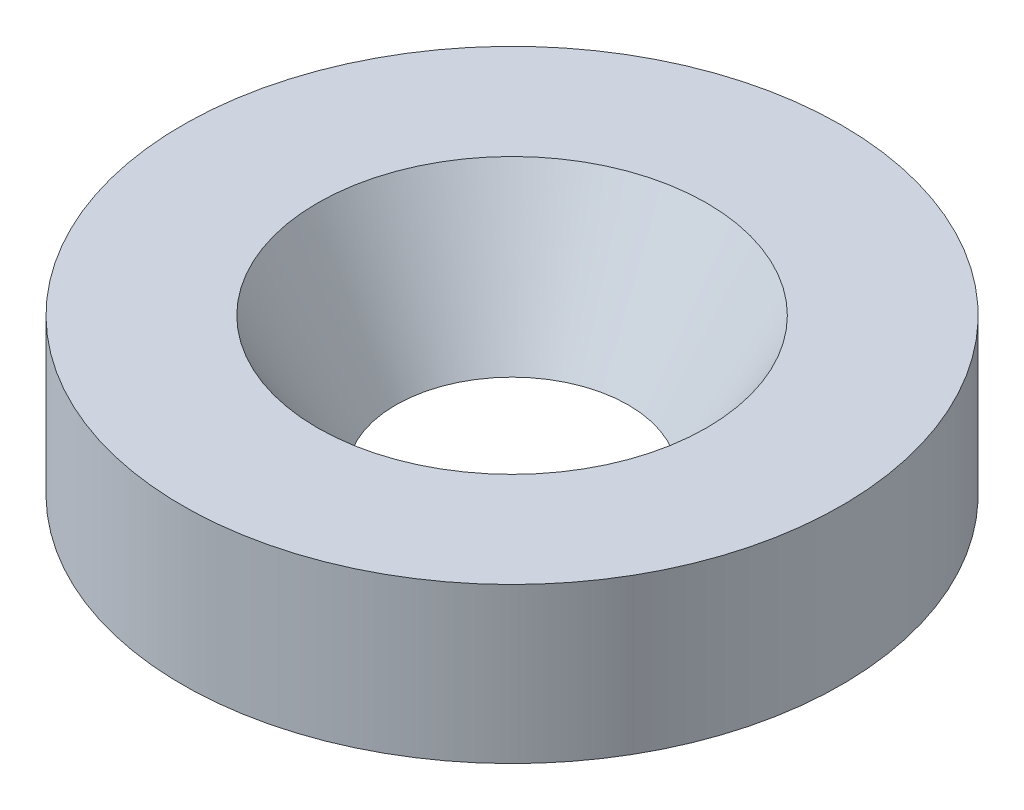
ISO-10303-21;
HEADER;
FILE_DESCRIPTION(('STEP AP214'),'2;1');
FILE_NAME('part.step','',(''),(''),'','','');
FILE_SCHEMA(('AUTOMOTIVE_DESIGN { 1 0 10303 214 1 1 1 1 }'));
ENDSEC;
DATA;
#1=APPLICATION_CONTEXT('core data for automotive mechanical design processes');
#2=APPLICATION_PROTOCOL_DEFINITION('international standard','automotive_design',2000,#1);
#3=PRODUCT_CONTEXT('',#1,'mechanical');
#4=PRODUCT('Part','Part','',(#3));
#5=PRODUCT_RELATED_PRODUCT_CATEGORY('part','',(#4));
#6=PRODUCT_DEFINITION_FORMATION('','',#4);
#7=PRODUCT_DEFINITION_CONTEXT('part definition',#1,'design');
#8=PRODUCT_DEFINITION('design','',#6,#7);
#9=PRODUCT_DEFINITION_SHAPE('','',#8);
#10=(LENGTH_UNIT() NAMED_UNIT(*) SI_UNIT(.MILLI.,.METRE.));
#11=(NAMED_UNIT(*) PLANE_ANGLE_UNIT() SI_UNIT($,.RADIAN.));
#12=(NAMED_UNIT(*) SI_UNIT($,.STERADIAN.) SOLID_ANGLE_UNIT());
#13=UNCERTAINTY_MEASURE_WITH_UNIT(LENGTH_MEASURE(1.E-05),#10,'distance_accuracy_value','');
#14=(GEOMETRIC_REPRESENTATION_CONTEXT(3) GLOBAL_UNCERTAINTY_ASSIGNED_CONTEXT((#13)) GLOBAL_UNIT_ASSIGNED_CONTEXT((#10,
#11,#12)) REPRESENTATION_CONTEXT('',''));
#15=CARTESIAN_POINT('',(0.,0.,0.));
#16=DIRECTION('',(0.,0.,1.));
#17=DIRECTION('',(1.,0.,0.));
#18=AXIS2_PLACEMENT_3D('',#15,#16,#17);
#19=CARTESIAN_POINT('',(8.,0.,0.));
#20=DIRECTION('',(0.,-1.,0.));
#21=DIRECTION('',(0.,0.,-1.));
#22=AXIS2_PLACEMENT_3D('',#19,#20,#21);
#23=PLANE('',#22);
#24=CARTESIAN_POINT('',(0.,0.,0.));
#25=DIRECTION('',(0.,-1.,0.));
#26=DIRECTION('',(0.,0.,-1.));
#27=AXIS2_PLACEMENT_3D('',#24,#25,#26);
#28=CIRCLE('',#27,8.5);
#29=CARTESIAN_POINT('',(0.,0.,-8.5));
#30=VERTEX_POINT('',#29);
#31=EDGE_CURVE('E10',#30,#30,#28,.T.);
#32=ORIENTED_EDGE('',*,*,#31,.T.);
#33=EDGE_LOOP('',(#32));
#34=FACE_BOUND('',#33,.T.);
#35=CARTESIAN_POINT('',(0.,0.,0.));
#36=DIRECTION('',(0.,-1.,0.));
#37=DIRECTION('',(0.,0.,-1.));
#38=AXIS2_PLACEMENT_3D('',#35,#36,#37);
#39=CIRCLE('',#38,8.);
#40=CARTESIAN_POINT('',(0.,0.,-8.));
#41=VERTEX_POINT('',#40);
#42=EDGE_CURVE('E65',#41,#41,#39,.T.);
#43=ORIENTED_EDGE('',*,*,#42,.F.);
#44=EDGE_LOOP('',(#43));
#45=FACE_BOUND('',#44,.T.);
#46=ADVANCED_FACE('F37',(#34,#45),#23,.T.);
#47=CARTESIAN_POINT('',(0.,0.,0.));
#48=DIRECTION('',(0.,-1.,0.));
#49=DIRECTION('',(0.,0.,-1.));
#50=AXIS2_PLACEMENT_3D('',#47,#48,#49);
#51=CYLINDRICAL_SURFACE('',#50,8.5);
#52=CARTESIAN_POINT('',(0.,4.,0.));
#53=DIRECTION('',(0.,-1.,0.));
#54=DIRECTION('',(0.,0.,-1.));
#55=AXIS2_PLACEMENT_3D('',#52,#53,#54);
#56=CIRCLE('',#55,8.5);
#57=CARTESIAN_POINT('',(0.,4.,-8.5));
#58=VERTEX_POINT('',#57);
#59=EDGE_CURVE('E43',#58,#58,#56,.T.);
#60=ORIENTED_EDGE('',*,*,#59,.T.);
#61=EDGE_LOOP('',(#60));
#62=FACE_BOUND('',#61,.T.);
#63=ORIENTED_EDGE('',*,*,#31,.F.);
#64=EDGE_LOOP('',(#63));
#65=FACE_BOUND('',#64,.T.);
#66=ADVANCED_FACE('F73',(#62,#65),#51,.T.);
#67=CARTESIAN_POINT('',(8.5,4.,0.));
#68=DIRECTION('',(0.,1.,0.));
#69=DIRECTION('',(0.,0.,1.));
#70=AXIS2_PLACEMENT_3D('',#67,#68,#69);
#71=PLANE('',#70);
#72=CARTESIAN_POINT('',(0.,4.,0.));
#73=DIRECTION('',(0.,-1.,0.));
#74=DIRECTION('',(0.,0.,-1.));
#75=AXIS2_PLACEMENT_3D('',#72,#73,#74);
#76=CIRCLE('',#75,5.02072594216371);
#77=CARTESIAN_POINT('',(0.,4.,-5.02072594216371));
#78=VERTEX_POINT('',#77);
#79=EDGE_CURVE('E47',#78,#78,#76,.T.);
#80=ORIENTED_EDGE('',*,*,#79,.T.);
#81=EDGE_LOOP('',(#80));
#82=FACE_BOUND('',#81,.T.);
#83=ORIENTED_EDGE('',*,*,#59,.F.);
#84=EDGE_LOOP('',(#83));
#85=FACE_BOUND('',#84,.T.);
#86=ADVANCED_FACE('F77',(#82,#85),#71,.T.);
#87=CARTESIAN_POINT('',(0.,4.,0.));
#88=DIRECTION('',(0.,1.,0.));
#89=DIRECTION('',(0.,0.,1.));
#90=AXIS2_PLACEMENT_3D('',#87,#88,#89);
#91=CONICAL_SURFACE('',#90,5.02072594216371,0.523598775598303);
#92=CARTESIAN_POINT('',(0.,0.5,0.));
#93=DIRECTION('',(0.,-1.,0.));
#94=DIRECTION('',(0.,0.,-1.));
#95=AXIS2_PLACEMENT_3D('',#92,#93,#94);
#96=CIRCLE('',#95,3.);
#97=CARTESIAN_POINT('',(0.,0.5,-3.));
#98=VERTEX_POINT('',#97);
#99=EDGE_CURVE('E51',#98,#98,#96,.T.);
#100=ORIENTED_EDGE('',*,*,#99,.T.);
#101=EDGE_LOOP('',(#100));
#102=FACE_BOUND('',#101,.T.);
#103=ORIENTED_EDGE('',*,*,#79,.F.);
#104=EDGE_LOOP('',(#103));
#105=FACE_BOUND('',#104,.T.);
#106=ADVANCED_FACE('F81',(#102,#105),#91,.F.);
#107=CARTESIAN_POINT('',(3.,0.5,0.));
#108=DIRECTION('',(0.,-1.,0.));
#109=DIRECTION('',(0.,0.,-1.));
#110=AXIS2_PLACEMENT_3D('',#107,#108,#109);
#111=PLANE('',#110);
#112=CARTESIAN_POINT('',(0.,0.5,0.));
#113=DIRECTION('',(0.,-1.,0.));
#114=DIRECTION('',(0.,0.,-1.));
#115=AXIS2_PLACEMENT_3D('',#112,#113,#114);
#116=CIRCLE('',#115,6.);
#117=CARTESIAN_POINT('',(0.,0.5,-6.));
#118=VERTEX_POINT('',#117);
#119=EDGE_CURVE('E56',#118,#118,#116,.T.);
#120=ORIENTED_EDGE('',*,*,#119,.T.);
#121=EDGE_LOOP('',(#120));
#122=FACE_BOUND('',#121,.T.);
#123=ORIENTED_EDGE('',*,*,#99,.F.);
#124=EDGE_LOOP('',(#123));
#125=FACE_BOUND('',#124,.T.);
#126=ADVANCED_FACE('F88',(#122,#125),#111,.T.);
#127=CARTESIAN_POINT('',(0.,0.,0.));
#128=DIRECTION('',(0.,-1.,0.));
#129=DIRECTION('',(0.,0.,-1.));
#130=AXIS2_PLACEMENT_3D('',#127,#128,#129);
#131=CYLINDRICAL_SURFACE('',#130,6.);
#132=CARTESIAN_POINT('',(0.,2.75,0.));
#133=DIRECTION('',(0.,-1.,0.));
#134=DIRECTION('',(0.,0.,-1.));
#135=AXIS2_PLACEMENT_3D('',#132,#133,#134);
#136=CIRCLE('',#135,6.);
#137=CARTESIAN_POINT('',(0.,2.75,-6.));
#138=VERTEX_POINT('',#137);
#139=EDGE_CURVE('E59',#138,#138,#136,.T.);
#140=ORIENTED_EDGE('',*,*,#139,.T.);
#141=EDGE_LOOP('',(#140));
#142=FACE_BOUND('',#141,.T.);
#143=ORIENTED_EDGE('',*,*,#119,.F.);
#144=EDGE_LOOP('',(#143));
#145=FACE_BOUND('',#144,.T.);
#146=ADVANCED_FACE('F92',(#142,#145),#131,.T.);
#147=CARTESIAN_POINT('',(6.,2.75,0.));
#148=DIRECTION('',(0.,-1.,0.));
#149=DIRECTION('',(0.,0.,-1.));
#150=AXIS2_PLACEMENT_3D('',#147,#148,#149);
#151=PLANE('',#150);
#152=CARTESIAN_POINT('',(0.,2.75,0.));
#153=DIRECTION('',(0.,-1.,0.));
#154=DIRECTION('',(0.,0.,-1.));
#155=AXIS2_PLACEMENT_3D('',#152,#153,#154);
#156=CIRCLE('',#155,8.);
#157=CARTESIAN_POINT('',(0.,2.75,-8.));
#158=VERTEX_POINT('',#157);
#159=EDGE_CURVE('E62',#158,#158,#156,.T.);
#160=ORIENTED_EDGE('',*,*,#159,.T.);
#161=EDGE_LOOP('',(#160));
#162=FACE_BOUND('',#161,.T.);
#163=ORIENTED_EDGE('',*,*,#139,.F.);
#164=EDGE_LOOP('',(#163));
#165=FACE_BOUND('',#164,.T.);
#166=ADVANCED_FACE('F96',(#162,#165),#151,.T.);
#167=CARTESIAN_POINT('',(0.,0.,0.));
#168=DIRECTION('',(0.,-1.,0.));
#169=DIRECTION('',(0.,0.,-1.));
#170=AXIS2_PLACEMENT_3D('',#167,#168,#169);
#171=CYLINDRICAL_SURFACE('',#170,8.);
#172=ORIENTED_EDGE('',*,*,#42,.T.);
#173=EDGE_LOOP('',(#172));
#174=FACE_BOUND('',#173,.T.);
#175=ORIENTED_EDGE('',*,*,#159,.F.);
#176=EDGE_LOOP('',(#175));
#177=FACE_BOUND('',#176,.T.);
#178=ADVANCED_FACE('F69',(#174,#177),#171,.F.);
#179=CLOSED_SHELL('',(#46,#66,#86,#106,#126,#146,#166,#178));
#180=MANIFOLD_SOLID_BREP('B2',#179);
#181=ADVANCED_BREP_SHAPE_REPRESENTATION('',(#18,#180),#14);
#182=SHAPE_DEFINITION_REPRESENTATION(#9,#181);
ENDSEC;
END-ISO-10303-21;
